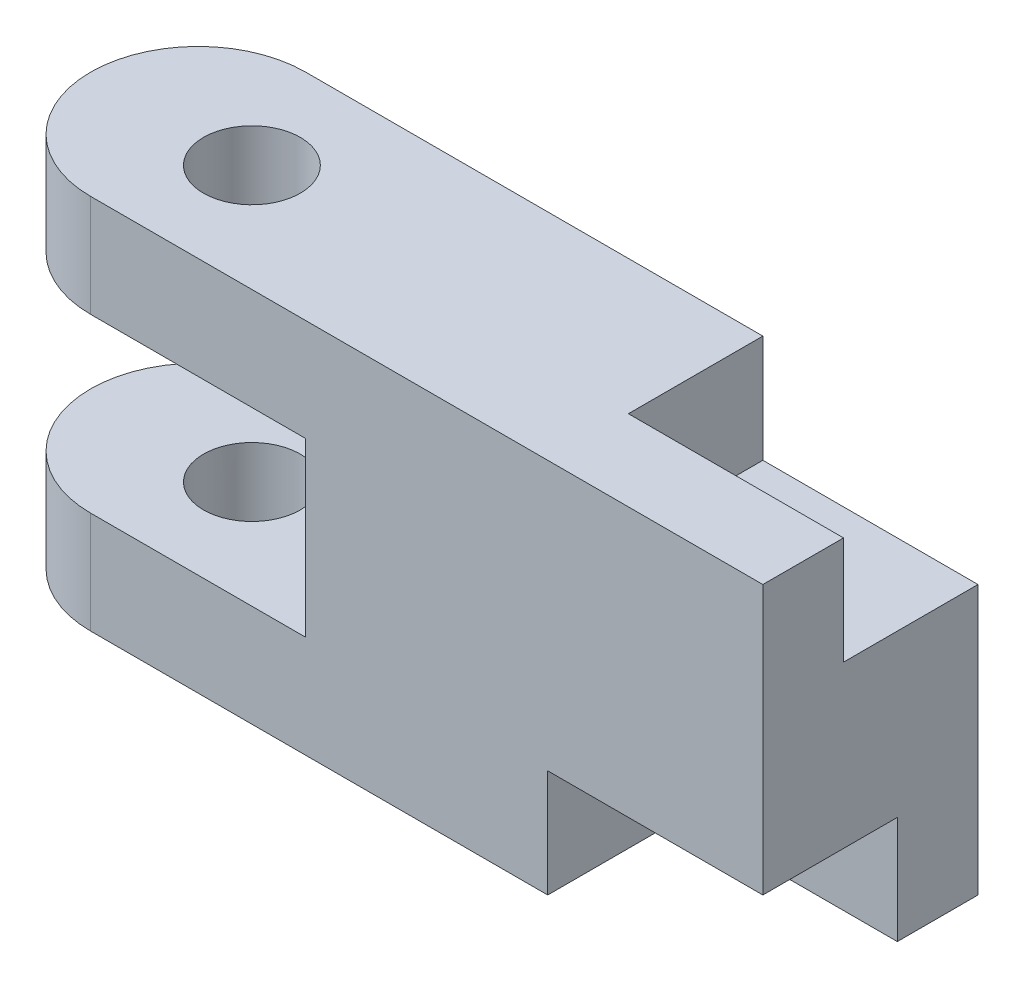
ISO-10303-21;
HEADER;
FILE_DESCRIPTION(('STEP AP214'),'2;1');
FILE_NAME('part.step','',(''),(''),'','','');
FILE_SCHEMA(('AUTOMOTIVE_DESIGN { 1 0 10303 214 1 1 1 1 }'));
ENDSEC;
DATA;
#1=APPLICATION_CONTEXT('core data for automotive mechanical design processes');
#2=APPLICATION_PROTOCOL_DEFINITION('international standard','automotive_design',2000,#1);
#3=PRODUCT_CONTEXT('',#1,'mechanical');
#4=PRODUCT('Part','Part','',(#3));
#5=PRODUCT_RELATED_PRODUCT_CATEGORY('part','',(#4));
#6=PRODUCT_DEFINITION_FORMATION('','',#4);
#7=PRODUCT_DEFINITION_CONTEXT('part definition',#1,'design');
#8=PRODUCT_DEFINITION('design','',#6,#7);
#9=PRODUCT_DEFINITION_SHAPE('','',#8);
#10=(LENGTH_UNIT() NAMED_UNIT(*) SI_UNIT(.MILLI.,.METRE.));
#11=(NAMED_UNIT(*) PLANE_ANGLE_UNIT() SI_UNIT($,.RADIAN.));
#12=(NAMED_UNIT(*) SI_UNIT($,.STERADIAN.) SOLID_ANGLE_UNIT());
#13=UNCERTAINTY_MEASURE_WITH_UNIT(LENGTH_MEASURE(1.E-05),#10,'distance_accuracy_value','');
#14=(GEOMETRIC_REPRESENTATION_CONTEXT(3) GLOBAL_UNCERTAINTY_ASSIGNED_CONTEXT((#13)) GLOBAL_UNIT_ASSIGNED_CONTEXT((#10,
#11,#12)) REPRESENTATION_CONTEXT('',''));
#15=CARTESIAN_POINT('',(0.,0.,0.));
#16=DIRECTION('',(0.,0.,1.));
#17=DIRECTION('',(1.,0.,0.));
#18=AXIS2_PLACEMENT_3D('',#15,#16,#17);
#19=CARTESIAN_POINT('',(-1.,7.,0.));
#20=DIRECTION('',(0.,-1.,0.));
#21=DIRECTION('',(0.,0.,-1.));
#22=AXIS2_PLACEMENT_3D('',#19,#20,#21);
#23=CYLINDRICAL_SURFACE('',#22,2.);
#24=DIRECTION('',(0.,-1.,0.));
#25=VECTOR('',#24,1.);
#26=CARTESIAN_POINT('',(-1.,7.,-2.));
#27=LINE('',#26,#25);
#28=CARTESIAN_POINT('',(-1.,7.,-2.));
#29=VERTEX_POINT('',#28);
#30=CARTESIAN_POINT('',(-1.,5.1,-2.));
#31=VERTEX_POINT('',#30);
#32=EDGE_CURVE('E289',#29,#31,#27,.T.);
#33=ORIENTED_EDGE('',*,*,#32,.T.);
#34=CARTESIAN_POINT('',(-1.,5.1,0.));
#35=DIRECTION('',(0.,1.,0.));
#36=DIRECTION('',(-1.,0.,0.));
#37=AXIS2_PLACEMENT_3D('',#34,#35,#36);
#38=CIRCLE('',#37,2.);
#39=CARTESIAN_POINT('',(-1.,5.1,2.));
#40=VERTEX_POINT('',#39);
#41=EDGE_CURVE('E215',#40,#31,#38,.F.);
#42=ORIENTED_EDGE('',*,*,#41,.F.);
#43=DIRECTION('',(0.,-1.,0.));
#44=VECTOR('',#43,1.);
#45=CARTESIAN_POINT('',(-1.,7.,2.));
#46=LINE('',#45,#44);
#47=CARTESIAN_POINT('',(-1.,7.,2.));
#48=VERTEX_POINT('',#47);
#49=EDGE_CURVE('E11',#48,#40,#46,.T.);
#50=ORIENTED_EDGE('',*,*,#49,.F.);
#51=CARTESIAN_POINT('',(-1.,7.,0.));
#52=DIRECTION('',(0.,1.,0.));
#53=DIRECTION('',(0.,0.,1.));
#54=AXIS2_PLACEMENT_3D('',#51,#52,#53);
#55=CIRCLE('',#54,2.);
#56=EDGE_CURVE('E262',#29,#48,#55,.T.);
#57=ORIENTED_EDGE('',*,*,#56,.F.);
#58=EDGE_LOOP('',(#33,#42,#50,#57));
#59=FACE_BOUND('',#58,.T.);
#60=ADVANCED_FACE('F45',(#59),#23,.T.);
#61=CARTESIAN_POINT('',(0.,7.,0.));
#62=DIRECTION('',(0.,-1.,0.));
#63=DIRECTION('',(0.,0.,-1.));
#64=AXIS2_PLACEMENT_3D('',#61,#62,#63);
#65=CYLINDRICAL_SURFACE('',#64,0.9);
#66=CARTESIAN_POINT('',(0.,5.1,0.));
#67=DIRECTION('',(0.,1.,0.));
#68=DIRECTION('',(-1.,0.,0.));
#69=AXIS2_PLACEMENT_3D('',#66,#67,#68);
#70=CIRCLE('',#69,0.9);
#71=CARTESIAN_POINT('',(-0.9,5.1,0.));
#72=VERTEX_POINT('',#71);
#73=EDGE_CURVE('E219',#72,#72,#70,.F.);
#74=ORIENTED_EDGE('',*,*,#73,.T.);
#75=EDGE_LOOP('',(#74));
#76=FACE_BOUND('',#75,.T.);
#77=CARTESIAN_POINT('',(0.,7.,0.));
#78=DIRECTION('',(0.,1.,0.));
#79=DIRECTION('',(0.,0.,1.));
#80=AXIS2_PLACEMENT_3D('',#77,#78,#79);
#81=CIRCLE('',#80,0.9);
#82=CARTESIAN_POINT('',(0.,7.,0.9));
#83=VERTEX_POINT('',#82);
#84=EDGE_CURVE('E254',#83,#83,#81,.T.);
#85=ORIENTED_EDGE('',*,*,#84,.T.);
#86=EDGE_LOOP('',(#85));
#87=FACE_BOUND('',#86,.T.);
#88=ADVANCED_FACE('F357',(#76,#87),#65,.F.);
#89=CARTESIAN_POINT('',(-1.,7.,0.));
#90=DIRECTION('',(0.,1.,0.));
#91=DIRECTION('',(0.,0.,1.));
#92=AXIS2_PLACEMENT_3D('',#89,#90,#91);
#93=PLANE('',#92);
#94=DIRECTION('',(1.,0.,0.));
#95=VECTOR('',#94,1.);
#96=CARTESIAN_POINT('',(7.5,7.,0.5));
#97=LINE('',#96,#95);
#98=CARTESIAN_POINT('',(7.5,7.,0.5));
#99=VERTEX_POINT('',#98);
#100=CARTESIAN_POINT('',(11.5,7.,0.5));
#101=VERTEX_POINT('',#100);
#102=EDGE_CURVE('E152',#99,#101,#97,.T.);
#103=ORIENTED_EDGE('',*,*,#102,.F.);
#104=DIRECTION('',(0.,0.,1.));
#105=VECTOR('',#104,1.);
#106=CARTESIAN_POINT('',(7.5,7.,-2.));
#107=LINE('',#106,#105);
#108=CARTESIAN_POINT('',(7.5,7.,-2.));
#109=VERTEX_POINT('',#108);
#110=EDGE_CURVE('E156',#109,#99,#107,.T.);
#111=ORIENTED_EDGE('',*,*,#110,.F.);
#112=DIRECTION('',(-1.,0.,0.));
#113=VECTOR('',#112,1.);
#114=CARTESIAN_POINT('',(-1.,7.,-2.));
#115=LINE('',#114,#113);
#116=EDGE_CURVE('E272',#109,#29,#115,.T.);
#117=ORIENTED_EDGE('',*,*,#116,.T.);
#118=ORIENTED_EDGE('',*,*,#56,.T.);
#119=DIRECTION('',(1.,0.,0.));
#120=VECTOR('',#119,1.);
#121=CARTESIAN_POINT('',(-1.,7.,2.));
#122=LINE('',#121,#120);
#123=CARTESIAN_POINT('',(11.5,7.,2.));
#124=VERTEX_POINT('',#123);
#125=EDGE_CURVE('E266',#48,#124,#122,.T.);
#126=ORIENTED_EDGE('',*,*,#125,.T.);
#127=DIRECTION('',(0.,0.,-1.));
#128=VECTOR('',#127,1.);
#129=CARTESIAN_POINT('',(11.5,7.,-2.));
#130=LINE('',#129,#128);
#131=EDGE_CURVE('E171',#124,#101,#130,.T.);
#132=ORIENTED_EDGE('',*,*,#131,.T.);
#133=EDGE_LOOP('',(#103,#111,#117,#118,#126,#132));
#134=FACE_BOUND('',#133,.T.);
#135=ORIENTED_EDGE('',*,*,#84,.F.);
#136=EDGE_LOOP('',(#135));
#137=FACE_BOUND('',#136,.T.);
#138=ADVANCED_FACE('F168',(#134,#137),#93,.T.);
#139=CARTESIAN_POINT('',(-1.,0.,0.));
#140=DIRECTION('',(0.,1.,0.));
#141=DIRECTION('',(0.,0.,1.));
#142=AXIS2_PLACEMENT_3D('',#139,#140,#141);
#143=PLANE('',#142);
#144=DIRECTION('',(0.,0.,-1.));
#145=VECTOR('',#144,1.);
#146=CARTESIAN_POINT('',(11.5,0.,-2.));
#147=LINE('',#146,#145);
#148=CARTESIAN_POINT('',(11.5,0.,-0.500000000000002));
#149=VERTEX_POINT('',#148);
#150=CARTESIAN_POINT('',(11.5,0.,-2.));
#151=VERTEX_POINT('',#150);
#152=EDGE_CURVE('E283',#149,#151,#147,.T.);
#153=ORIENTED_EDGE('',*,*,#152,.F.);
#154=DIRECTION('',(1.,0.,0.));
#155=VECTOR('',#154,1.);
#156=CARTESIAN_POINT('',(7.5,0.,-0.500000000000001));
#157=LINE('',#156,#155);
#158=CARTESIAN_POINT('',(7.5,0.,-0.500000000000001));
#159=VERTEX_POINT('',#158);
#160=EDGE_CURVE('E61',#159,#149,#157,.T.);
#161=ORIENTED_EDGE('',*,*,#160,.F.);
#162=DIRECTION('',(0.,0.,-1.));
#163=VECTOR('',#162,1.);
#164=CARTESIAN_POINT('',(7.5,0.,2.));
#165=LINE('',#164,#163);
#166=CARTESIAN_POINT('',(7.5,0.,2.));
#167=VERTEX_POINT('',#166);
#168=EDGE_CURVE('E206',#167,#159,#165,.T.);
#169=ORIENTED_EDGE('',*,*,#168,.F.);
#170=DIRECTION('',(1.,0.,0.));
#171=VECTOR('',#170,1.);
#172=CARTESIAN_POINT('',(-1.,0.,2.));
#173=LINE('',#172,#171);
#174=CARTESIAN_POINT('',(-1.,0.,2.));
#175=VERTEX_POINT('',#174);
#176=EDGE_CURVE('E279',#175,#167,#173,.T.);
#177=ORIENTED_EDGE('',*,*,#176,.F.);
#178=CARTESIAN_POINT('',(-1.,0.,0.));
#179=DIRECTION('',(0.,1.,0.));
#180=DIRECTION('',(0.,0.,1.));
#181=AXIS2_PLACEMENT_3D('',#178,#179,#180);
#182=CIRCLE('',#181,2.);
#183=CARTESIAN_POINT('',(-1.,0.,-2.));
#184=VERTEX_POINT('',#183);
#185=EDGE_CURVE('E258',#184,#175,#182,.T.);
#186=ORIENTED_EDGE('',*,*,#185,.F.);
#187=DIRECTION('',(-1.,0.,0.));
#188=VECTOR('',#187,1.);
#189=CARTESIAN_POINT('',(-1.,0.,-2.));
#190=LINE('',#189,#188);
#191=EDGE_CURVE('E267',#151,#184,#190,.T.);
#192=ORIENTED_EDGE('',*,*,#191,.F.);
#193=EDGE_LOOP('',(#153,#161,#169,#177,#186,#192));
#194=FACE_BOUND('',#193,.T.);
#195=CARTESIAN_POINT('',(0.,0.,0.));
#196=DIRECTION('',(0.,1.,0.));
#197=DIRECTION('',(0.,0.,1.));
#198=AXIS2_PLACEMENT_3D('',#195,#196,#197);
#199=CIRCLE('',#198,0.9);
#200=CARTESIAN_POINT('',(0.,0.,0.9));
#201=VERTEX_POINT('',#200);
#202=EDGE_CURVE('E253',#201,#201,#199,.T.);
#203=ORIENTED_EDGE('',*,*,#202,.T.);
#204=EDGE_LOOP('',(#203));
#205=FACE_BOUND('',#204,.T.);
#206=ADVANCED_FACE('F316',(#194,#205),#143,.F.);
#207=CARTESIAN_POINT('',(-1.,1.9,2.));
#208=VERTEX_POINT('',#207);
#209=EDGE_CURVE('E54',#208,#175,#46,.T.);
#210=ORIENTED_EDGE('',*,*,#209,.F.);
#211=CARTESIAN_POINT('',(-1.,1.9,0.));
#212=DIRECTION('',(0.,-1.,0.));
#213=DIRECTION('',(1.,0.,0.));
#214=AXIS2_PLACEMENT_3D('',#211,#212,#213);
#215=CIRCLE('',#214,2.);
#216=CARTESIAN_POINT('',(-1.,1.9,-2.));
#217=VERTEX_POINT('',#216);
#218=EDGE_CURVE('E212',#217,#208,#215,.F.);
#219=ORIENTED_EDGE('',*,*,#218,.F.);
#220=EDGE_CURVE('E275',#217,#184,#27,.T.);
#221=ORIENTED_EDGE('',*,*,#220,.T.);
#222=ORIENTED_EDGE('',*,*,#185,.T.);
#223=EDGE_LOOP('',(#210,#219,#221,#222));
#224=FACE_BOUND('',#223,.T.);
#225=ADVANCED_FACE('F47',(#224),#23,.T.);
#226=CARTESIAN_POINT('',(-1.,7.,2.));
#227=DIRECTION('',(0.,0.,-1.));
#228=DIRECTION('',(-1.,0.,0.));
#229=AXIS2_PLACEMENT_3D('',#226,#227,#228);
#230=PLANE('',#229);
#231=DIRECTION('',(0.,-1.,0.));
#232=VECTOR('',#231,1.);
#233=CARTESIAN_POINT('',(7.5,2.,2.));
#234=LINE('',#233,#232);
#235=CARTESIAN_POINT('',(7.5,2.,2.));
#236=VERTEX_POINT('',#235);
#237=EDGE_CURVE('E195',#236,#167,#234,.T.);
#238=ORIENTED_EDGE('',*,*,#237,.F.);
#239=DIRECTION('',(1.,0.,0.));
#240=VECTOR('',#239,1.);
#241=CARTESIAN_POINT('',(7.5,2.,2.));
#242=LINE('',#241,#240);
#243=CARTESIAN_POINT('',(11.5,2.,2.));
#244=VERTEX_POINT('',#243);
#245=EDGE_CURVE('E187',#236,#244,#242,.T.);
#246=ORIENTED_EDGE('',*,*,#245,.T.);
#247=DIRECTION('',(0.,-1.,0.));
#248=VECTOR('',#247,1.);
#249=CARTESIAN_POINT('',(11.5,7.,2.));
#250=LINE('',#249,#248);
#251=EDGE_CURVE('E296',#124,#244,#250,.T.);
#252=ORIENTED_EDGE('',*,*,#251,.F.);
#253=ORIENTED_EDGE('',*,*,#125,.F.);
#254=ORIENTED_EDGE('',*,*,#49,.T.);
#255=DIRECTION('',(-1.,0.,0.));
#256=VECTOR('',#255,1.);
#257=CARTESIAN_POINT('',(-3.,5.1,2.));
#258=LINE('',#257,#256);
#259=CARTESIAN_POINT('',(3.,5.1,2.));
#260=VERTEX_POINT('',#259);
#261=EDGE_CURVE('E238',#260,#40,#258,.T.);
#262=ORIENTED_EDGE('',*,*,#261,.F.);
#263=DIRECTION('',(0.,1.,0.));
#264=VECTOR('',#263,1.);
#265=CARTESIAN_POINT('',(3.,5.1,2.));
#266=LINE('',#265,#264);
#267=CARTESIAN_POINT('',(3.,1.9,2.));
#268=VERTEX_POINT('',#267);
#269=EDGE_CURVE('E234',#268,#260,#266,.T.);
#270=ORIENTED_EDGE('',*,*,#269,.F.);
#271=DIRECTION('',(1.,0.,0.));
#272=VECTOR('',#271,1.);
#273=CARTESIAN_POINT('',(-3.,1.9,2.));
#274=LINE('',#273,#272);
#275=EDGE_CURVE('E230',#208,#268,#274,.T.);
#276=ORIENTED_EDGE('',*,*,#275,.F.);
#277=ORIENTED_EDGE('',*,*,#209,.T.);
#278=ORIENTED_EDGE('',*,*,#176,.T.);
#279=EDGE_LOOP('',(#238,#246,#252,#253,#254,#262,#270,#276,#277,#278));
#280=FACE_BOUND('',#279,.T.);
#281=ADVANCED_FACE('F308',(#280),#230,.F.);
#282=CARTESIAN_POINT('',(11.5,7.,-2.));
#283=DIRECTION('',(-1.,0.,0.));
#284=DIRECTION('',(0.,0.,1.));
#285=AXIS2_PLACEMENT_3D('',#282,#283,#284);
#286=PLANE('',#285);
#287=DIRECTION('',(0.,-1.,0.));
#288=VECTOR('',#287,1.);
#289=CARTESIAN_POINT('',(11.5,7.,-2.));
#290=LINE('',#289,#288);
#291=CARTESIAN_POINT('',(11.5,5.,-2.));
#292=VERTEX_POINT('',#291);
#293=EDGE_CURVE('E293',#292,#151,#290,.T.);
#294=ORIENTED_EDGE('',*,*,#293,.F.);
#295=DIRECTION('',(0.,0.,-1.));
#296=VECTOR('',#295,1.);
#297=CARTESIAN_POINT('',(11.5,5.,0.5));
#298=LINE('',#297,#296);
#299=CARTESIAN_POINT('',(11.5,5.,0.5));
#300=VERTEX_POINT('',#299);
#301=EDGE_CURVE('E165',#300,#292,#298,.T.);
#302=ORIENTED_EDGE('',*,*,#301,.F.);
#303=DIRECTION('',(0.,-1.,0.));
#304=VECTOR('',#303,1.);
#305=CARTESIAN_POINT('',(11.5,7.,0.5));
#306=LINE('',#305,#304);
#307=EDGE_CURVE('E198',#101,#300,#306,.T.);
#308=ORIENTED_EDGE('',*,*,#307,.F.);
#309=ORIENTED_EDGE('',*,*,#131,.F.);
#310=ORIENTED_EDGE('',*,*,#251,.T.);
#311=DIRECTION('',(0.,0.,1.));
#312=VECTOR('',#311,1.);
#313=CARTESIAN_POINT('',(11.5,2.,2.));
#314=LINE('',#313,#312);
#315=CARTESIAN_POINT('',(11.5,2.,-0.500000000000001));
#316=VERTEX_POINT('',#315);
#317=EDGE_CURVE('E191',#316,#244,#314,.T.);
#318=ORIENTED_EDGE('',*,*,#317,.F.);
#319=DIRECTION('',(0.,1.,0.));
#320=VECTOR('',#319,1.);
#321=CARTESIAN_POINT('',(11.5,2.,-0.500000000000001));
#322=LINE('',#321,#320);
#323=EDGE_CURVE('E194',#149,#316,#322,.T.);
#324=ORIENTED_EDGE('',*,*,#323,.F.);
#325=ORIENTED_EDGE('',*,*,#152,.T.);
#326=EDGE_LOOP('',(#294,#302,#308,#309,#310,#318,#324,#325));
#327=FACE_BOUND('',#326,.T.);
#328=ADVANCED_FACE('F326',(#327),#286,.F.);
#329=CARTESIAN_POINT('',(-1.,7.,-2.));
#330=DIRECTION('',(0.,0.,1.));
#331=DIRECTION('',(1.,0.,0.));
#332=AXIS2_PLACEMENT_3D('',#329,#330,#331);
#333=PLANE('',#332);
#334=DIRECTION('',(0.,1.,0.));
#335=VECTOR('',#334,1.);
#336=CARTESIAN_POINT('',(7.5,5.,-2.));
#337=LINE('',#336,#335);
#338=CARTESIAN_POINT('',(7.5,5.,-2.));
#339=VERTEX_POINT('',#338);
#340=EDGE_CURVE('E161',#339,#109,#337,.T.);
#341=ORIENTED_EDGE('',*,*,#340,.F.);
#342=DIRECTION('',(1.,0.,0.));
#343=VECTOR('',#342,1.);
#344=CARTESIAN_POINT('',(7.5,5.,-2.));
#345=LINE('',#344,#343);
#346=EDGE_CURVE('E176',#339,#292,#345,.T.);
#347=ORIENTED_EDGE('',*,*,#346,.T.);
#348=ORIENTED_EDGE('',*,*,#293,.T.);
#349=ORIENTED_EDGE('',*,*,#191,.T.);
#350=ORIENTED_EDGE('',*,*,#220,.F.);
#351=DIRECTION('',(-1.,0.,0.));
#352=VECTOR('',#351,1.);
#353=CARTESIAN_POINT('',(-3.,1.9,-2.));
#354=LINE('',#353,#352);
#355=CARTESIAN_POINT('',(3.,1.9,-2.));
#356=VERTEX_POINT('',#355);
#357=EDGE_CURVE('E245',#356,#217,#354,.T.);
#358=ORIENTED_EDGE('',*,*,#357,.F.);
#359=DIRECTION('',(0.,-1.,0.));
#360=VECTOR('',#359,1.);
#361=CARTESIAN_POINT('',(3.,5.1,-2.));
#362=LINE('',#361,#360);
#363=CARTESIAN_POINT('',(3.,5.1,-2.));
#364=VERTEX_POINT('',#363);
#365=EDGE_CURVE('E223',#364,#356,#362,.T.);
#366=ORIENTED_EDGE('',*,*,#365,.F.);
#367=DIRECTION('',(1.,0.,0.));
#368=VECTOR('',#367,1.);
#369=CARTESIAN_POINT('',(-3.,5.1,-2.));
#370=LINE('',#369,#368);
#371=EDGE_CURVE('E226',#31,#364,#370,.T.);
#372=ORIENTED_EDGE('',*,*,#371,.F.);
#373=ORIENTED_EDGE('',*,*,#32,.F.);
#374=ORIENTED_EDGE('',*,*,#116,.F.);
#375=EDGE_LOOP('',(#341,#347,#348,#349,#350,#358,#366,#372,#373,#374));
#376=FACE_BOUND('',#375,.T.);
#377=ADVANCED_FACE('F323',(#376),#333,.F.);
#378=CARTESIAN_POINT('',(0.,1.9,0.));
#379=DIRECTION('',(0.,-1.,0.));
#380=DIRECTION('',(1.,0.,0.));
#381=AXIS2_PLACEMENT_3D('',#378,#379,#380);
#382=CIRCLE('',#381,0.9);
#383=CARTESIAN_POINT('',(0.9,1.9,0.));
#384=VERTEX_POINT('',#383);
#385=EDGE_CURVE('E218',#384,#384,#382,.F.);
#386=ORIENTED_EDGE('',*,*,#385,.T.);
#387=EDGE_LOOP('',(#386));
#388=FACE_BOUND('',#387,.T.);
#389=ORIENTED_EDGE('',*,*,#202,.F.);
#390=EDGE_LOOP('',(#389));
#391=FACE_BOUND('',#390,.T.);
#392=ADVANCED_FACE('F364',(#388,#391),#65,.F.);
#393=CARTESIAN_POINT('',(-3.,5.1,-2.001));
#394=DIRECTION('',(0.,1.,0.));
#395=DIRECTION('',(-1.,0.,0.));
#396=AXIS2_PLACEMENT_3D('',#393,#394,#395);
#397=PLANE('',#396);
#398=ORIENTED_EDGE('',*,*,#73,.F.);
#399=EDGE_LOOP('',(#398));
#400=FACE_BOUND('',#399,.T.);
#401=ORIENTED_EDGE('',*,*,#41,.T.);
#402=ORIENTED_EDGE('',*,*,#371,.T.);
#403=DIRECTION('',(0.,0.,1.));
#404=VECTOR('',#403,1.);
#405=CARTESIAN_POINT('',(3.,5.1,-2.001));
#406=LINE('',#405,#404);
#407=EDGE_CURVE('E242',#364,#260,#406,.T.);
#408=ORIENTED_EDGE('',*,*,#407,.T.);
#409=ORIENTED_EDGE('',*,*,#261,.T.);
#410=EDGE_LOOP('',(#401,#402,#408,#409));
#411=FACE_BOUND('',#410,.T.);
#412=ADVANCED_FACE('F397',(#400,#411),#397,.F.);
#413=CARTESIAN_POINT('',(3.,5.1,-2.001));
#414=DIRECTION('',(1.,0.,0.));
#415=DIRECTION('',(0.,0.,-1.));
#416=AXIS2_PLACEMENT_3D('',#413,#414,#415);
#417=PLANE('',#416);
#418=ORIENTED_EDGE('',*,*,#365,.T.);
#419=DIRECTION('',(0.,0.,1.));
#420=VECTOR('',#419,1.);
#421=CARTESIAN_POINT('',(3.,1.9,-2.001));
#422=LINE('',#421,#420);
#423=EDGE_CURVE('E241',#356,#268,#422,.T.);
#424=ORIENTED_EDGE('',*,*,#423,.T.);
#425=ORIENTED_EDGE('',*,*,#269,.T.);
#426=ORIENTED_EDGE('',*,*,#407,.F.);
#427=EDGE_LOOP('',(#418,#424,#425,#426));
#428=FACE_BOUND('',#427,.T.);
#429=ADVANCED_FACE('F352',(#428),#417,.F.);
#430=CARTESIAN_POINT('',(-3.,1.9,-2.001));
#431=DIRECTION('',(0.,-1.,0.));
#432=DIRECTION('',(1.,0.,0.));
#433=AXIS2_PLACEMENT_3D('',#430,#431,#432);
#434=PLANE('',#433);
#435=ORIENTED_EDGE('',*,*,#385,.F.);
#436=EDGE_LOOP('',(#435));
#437=FACE_BOUND('',#436,.T.);
#438=ORIENTED_EDGE('',*,*,#218,.T.);
#439=ORIENTED_EDGE('',*,*,#275,.T.);
#440=ORIENTED_EDGE('',*,*,#423,.F.);
#441=ORIENTED_EDGE('',*,*,#357,.T.);
#442=EDGE_LOOP('',(#438,#439,#440,#441));
#443=FACE_BOUND('',#442,.T.);
#444=ADVANCED_FACE('F344',(#437,#443),#434,.F.);
#445=CARTESIAN_POINT('',(7.5,5.,0.5));
#446=DIRECTION('',(0.,-1.,0.));
#447=DIRECTION('',(0.,0.,-1.));
#448=AXIS2_PLACEMENT_3D('',#445,#446,#447);
#449=PLANE('',#448);
#450=ORIENTED_EDGE('',*,*,#301,.T.);
#451=ORIENTED_EDGE('',*,*,#346,.F.);
#452=DIRECTION('',(0.,0.,-1.));
#453=VECTOR('',#452,1.);
#454=CARTESIAN_POINT('',(7.5,5.,0.5));
#455=LINE('',#454,#453);
#456=CARTESIAN_POINT('',(7.5,5.,0.5));
#457=VERTEX_POINT('',#456);
#458=EDGE_CURVE('E69',#457,#339,#455,.T.);
#459=ORIENTED_EDGE('',*,*,#458,.F.);
#460=DIRECTION('',(1.,0.,0.));
#461=VECTOR('',#460,1.);
#462=CARTESIAN_POINT('',(7.5,5.,0.5));
#463=LINE('',#462,#461);
#464=EDGE_CURVE('E154',#457,#300,#463,.T.);
#465=ORIENTED_EDGE('',*,*,#464,.T.);
#466=EDGE_LOOP('',(#450,#451,#459,#465));
#467=FACE_BOUND('',#466,.T.);
#468=ADVANCED_FACE('F341',(#467),#449,.F.);
#469=CARTESIAN_POINT('',(7.5,7.,0.5));
#470=DIRECTION('',(0.,0.,1.));
#471=DIRECTION('',(0.,-1.,0.));
#472=AXIS2_PLACEMENT_3D('',#469,#470,#471);
#473=PLANE('',#472);
#474=ORIENTED_EDGE('',*,*,#307,.T.);
#475=ORIENTED_EDGE('',*,*,#464,.F.);
#476=DIRECTION('',(0.,-1.,0.));
#477=VECTOR('',#476,1.);
#478=CARTESIAN_POINT('',(7.5,7.,0.5));
#479=LINE('',#478,#477);
#480=EDGE_CURVE('E147',#99,#457,#479,.T.);
#481=ORIENTED_EDGE('',*,*,#480,.F.);
#482=ORIENTED_EDGE('',*,*,#102,.T.);
#483=EDGE_LOOP('',(#474,#475,#481,#482));
#484=FACE_BOUND('',#483,.T.);
#485=ADVANCED_FACE('F150',(#484),#473,.F.);
#486=CARTESIAN_POINT('',(7.5,0.,0.));
#487=DIRECTION('',(1.,0.,0.));
#488=DIRECTION('',(0.,0.,-1.));
#489=AXIS2_PLACEMENT_3D('',#486,#487,#488);
#490=PLANE('',#489);
#491=ORIENTED_EDGE('',*,*,#110,.T.);
#492=ORIENTED_EDGE('',*,*,#480,.T.);
#493=ORIENTED_EDGE('',*,*,#458,.T.);
#494=ORIENTED_EDGE('',*,*,#340,.T.);
#495=EDGE_LOOP('',(#491,#492,#493,#494));
#496=FACE_BOUND('',#495,.T.);
#497=ADVANCED_FACE('F159',(#496),#490,.T.);
#498=CARTESIAN_POINT('',(7.5,2.,2.));
#499=DIRECTION('',(0.,1.,0.));
#500=DIRECTION('',(0.,0.,1.));
#501=AXIS2_PLACEMENT_3D('',#498,#499,#500);
#502=PLANE('',#501);
#503=ORIENTED_EDGE('',*,*,#317,.T.);
#504=ORIENTED_EDGE('',*,*,#245,.F.);
#505=DIRECTION('',(0.,0.,1.));
#506=VECTOR('',#505,1.);
#507=CARTESIAN_POINT('',(7.5,2.,2.));
#508=LINE('',#507,#506);
#509=CARTESIAN_POINT('',(7.5,2.,-0.500000000000001));
#510=VERTEX_POINT('',#509);
#511=EDGE_CURVE('E183',#510,#236,#508,.T.);
#512=ORIENTED_EDGE('',*,*,#511,.F.);
#513=DIRECTION('',(1.,0.,0.));
#514=VECTOR('',#513,1.);
#515=CARTESIAN_POINT('',(7.5,2.,-0.500000000000001));
#516=LINE('',#515,#514);
#517=EDGE_CURVE('E184',#510,#316,#516,.T.);
#518=ORIENTED_EDGE('',*,*,#517,.T.);
#519=EDGE_LOOP('',(#503,#504,#512,#518));
#520=FACE_BOUND('',#519,.T.);
#521=ADVANCED_FACE('F333',(#520),#502,.F.);
#522=CARTESIAN_POINT('',(7.5,2.,-0.500000000000001));
#523=DIRECTION('',(0.,0.,-1.));
#524=DIRECTION('',(-1.,0.,0.));
#525=AXIS2_PLACEMENT_3D('',#522,#523,#524);
#526=PLANE('',#525);
#527=ORIENTED_EDGE('',*,*,#323,.T.);
#528=ORIENTED_EDGE('',*,*,#517,.F.);
#529=DIRECTION('',(0.,1.,0.));
#530=VECTOR('',#529,1.);
#531=CARTESIAN_POINT('',(7.5,2.,-0.500000000000001));
#532=LINE('',#531,#530);
#533=EDGE_CURVE('E202',#159,#510,#532,.T.);
#534=ORIENTED_EDGE('',*,*,#533,.F.);
#535=ORIENTED_EDGE('',*,*,#160,.T.);
#536=EDGE_LOOP('',(#527,#528,#534,#535));
#537=FACE_BOUND('',#536,.T.);
#538=ADVANCED_FACE('F328',(#537),#526,.F.);
#539=CARTESIAN_POINT('',(7.5,0.,0.));
#540=DIRECTION('',(1.,0.,0.));
#541=DIRECTION('',(0.,0.,-1.));
#542=AXIS2_PLACEMENT_3D('',#539,#540,#541);
#543=PLANE('',#542);
#544=ORIENTED_EDGE('',*,*,#237,.T.);
#545=ORIENTED_EDGE('',*,*,#168,.T.);
#546=ORIENTED_EDGE('',*,*,#533,.T.);
#547=ORIENTED_EDGE('',*,*,#511,.T.);
#548=EDGE_LOOP('',(#544,#545,#546,#547));
#549=FACE_BOUND('',#548,.T.);
#550=ADVANCED_FACE('F332',(#549),#543,.T.);
#551=CLOSED_SHELL('',(#60,#88,#138,#206,#225,#281,#328,#377,#392,#412,#429,#444,#468,#485,#497,
#521,#538,#550));
#552=MANIFOLD_SOLID_BREP('B2',#551);
#553=ADVANCED_BREP_SHAPE_REPRESENTATION('',(#18,#552),#14);
#554=SHAPE_DEFINITION_REPRESENTATION(#9,#553);
ENDSEC;
END-ISO-10303-21;
